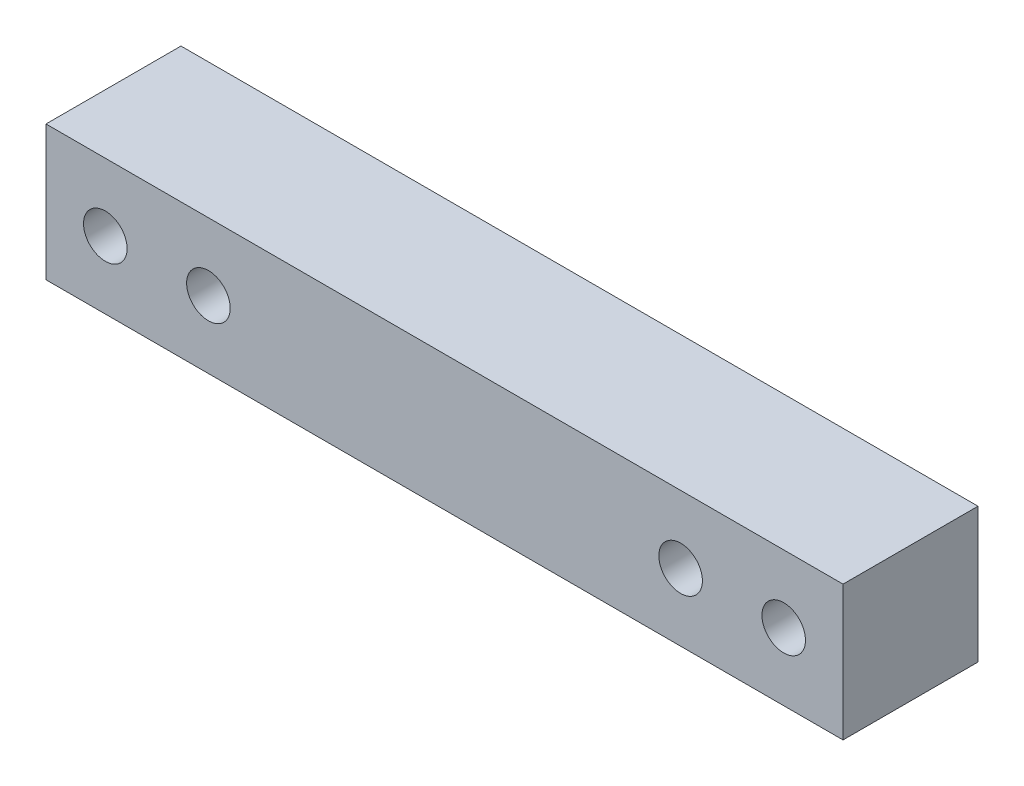
ISO-10303-21;
HEADER;
FILE_DESCRIPTION(('STEP AP214'),'2;1');
FILE_NAME('part.step','',(''),(''),'','','');
FILE_SCHEMA(('AUTOMOTIVE_DESIGN { 1 0 10303 214 1 1 1 1 }'));
ENDSEC;
DATA;
#1=APPLICATION_CONTEXT('core data for automotive mechanical design processes');
#2=APPLICATION_PROTOCOL_DEFINITION('international standard','automotive_design',2000,#1);
#3=PRODUCT_CONTEXT('',#1,'mechanical');
#4=PRODUCT('Part','Part','',(#3));
#5=PRODUCT_RELATED_PRODUCT_CATEGORY('part','',(#4));
#6=PRODUCT_DEFINITION_FORMATION('','',#4);
#7=PRODUCT_DEFINITION_CONTEXT('part definition',#1,'design');
#8=PRODUCT_DEFINITION('design','',#6,#7);
#9=PRODUCT_DEFINITION_SHAPE('','',#8);
#10=(LENGTH_UNIT() NAMED_UNIT(*) SI_UNIT(.MILLI.,.METRE.));
#11=(NAMED_UNIT(*) PLANE_ANGLE_UNIT() SI_UNIT($,.RADIAN.));
#12=(NAMED_UNIT(*) SI_UNIT($,.STERADIAN.) SOLID_ANGLE_UNIT());
#13=UNCERTAINTY_MEASURE_WITH_UNIT(LENGTH_MEASURE(1.E-05),#10,'distance_accuracy_value','');
#14=(GEOMETRIC_REPRESENTATION_CONTEXT(3) GLOBAL_UNCERTAINTY_ASSIGNED_CONTEXT((#13)) GLOBAL_UNIT_ASSIGNED_CONTEXT((#10,
#11,#12)) REPRESENTATION_CONTEXT('',''));
#15=CARTESIAN_POINT('',(0.,0.,0.));
#16=DIRECTION('',(0.,0.,1.));
#17=DIRECTION('',(1.,0.,0.));
#18=AXIS2_PLACEMENT_3D('',#15,#16,#17);
#19=CARTESIAN_POINT('',(-58.5761278195489,12.7,0.));
#20=DIRECTION('',(1.,0.,0.));
#21=DIRECTION('',(0.,0.,-1.));
#22=AXIS2_PLACEMENT_3D('',#19,#20,#21);
#23=PLANE('',#22);
#24=DIRECTION('',(0.,0.,1.));
#25=VECTOR('',#24,1.);
#26=CARTESIAN_POINT('',(-58.5761278195489,0.,0.));
#27=LINE('',#26,#25);
#28=CARTESIAN_POINT('',(-58.5761278195489,0.,-12.7));
#29=VERTEX_POINT('',#28);
#30=CARTESIAN_POINT('',(-58.5761278195489,0.,0.));
#31=VERTEX_POINT('',#30);
#32=EDGE_CURVE('E76',#29,#31,#27,.T.);
#33=ORIENTED_EDGE('',*,*,#32,.T.);
#34=DIRECTION('',(0.,-1.,0.));
#35=VECTOR('',#34,1.);
#36=CARTESIAN_POINT('',(-58.5761278195489,12.7,0.));
#37=LINE('',#36,#35);
#38=CARTESIAN_POINT('',(-58.5761278195489,12.7,0.));
#39=VERTEX_POINT('',#38);
#40=EDGE_CURVE('E11',#39,#31,#37,.T.);
#41=ORIENTED_EDGE('',*,*,#40,.F.);
#42=DIRECTION('',(0.,0.,1.));
#43=VECTOR('',#42,1.);
#44=CARTESIAN_POINT('',(-58.5761278195489,12.7,0.));
#45=LINE('',#44,#43);
#46=CARTESIAN_POINT('',(-58.5761278195489,12.7,-12.7));
#47=VERTEX_POINT('',#46);
#48=EDGE_CURVE('E66',#47,#39,#45,.T.);
#49=ORIENTED_EDGE('',*,*,#48,.F.);
#50=DIRECTION('',(0.,-1.,0.));
#51=VECTOR('',#50,1.);
#52=CARTESIAN_POINT('',(-58.5761278195489,0.,-12.7));
#53=LINE('',#52,#51);
#54=EDGE_CURVE('E86',#47,#29,#53,.T.);
#55=ORIENTED_EDGE('',*,*,#54,.T.);
#56=EDGE_LOOP('',(#33,#41,#49,#55));
#57=FACE_BOUND('',#56,.T.);
#58=ADVANCED_FACE('F33',(#57),#23,.F.);
#59=CARTESIAN_POINT('',(-58.5761278195489,12.7,0.));
#60=DIRECTION('',(0.,0.,-1.));
#61=DIRECTION('',(-1.,0.,0.));
#62=AXIS2_PLACEMENT_3D('',#59,#60,#61);
#63=PLANE('',#62);
#64=CARTESIAN_POINT('',(10.8415413533835,6.35,0.));
#65=DIRECTION('',(0.,0.,-1.));
#66=DIRECTION('',(-1.,0.,0.));
#67=AXIS2_PLACEMENT_3D('',#64,#65,#66);
#68=CIRCLE('',#67,2.05000000000001);
#69=CARTESIAN_POINT('',(8.79154135338345,6.35,0.));
#70=VERTEX_POINT('',#69);
#71=EDGE_CURVE('E141',#70,#70,#68,.F.);
#72=ORIENTED_EDGE('',*,*,#71,.F.);
#73=EDGE_LOOP('',(#72));
#74=FACE_BOUND('',#73,.T.);
#75=CARTESIAN_POINT('',(1.14154135338344,6.35,0.));
#76=DIRECTION('',(0.,0.,-1.));
#77=DIRECTION('',(-1.,0.,0.));
#78=AXIS2_PLACEMENT_3D('',#75,#76,#77);
#79=CIRCLE('',#78,2.05000000000001);
#80=CARTESIAN_POINT('',(-0.908458646616564,6.35,0.));
#81=VERTEX_POINT('',#80);
#82=EDGE_CURVE('E145',#81,#81,#79,.F.);
#83=ORIENTED_EDGE('',*,*,#82,.F.);
#84=EDGE_LOOP('',(#83));
#85=FACE_BOUND('',#84,.T.);
#86=CARTESIAN_POINT('',(-43.2937969924812,6.35,0.));
#87=DIRECTION('',(0.,0.,-1.));
#88=DIRECTION('',(-1.,0.,0.));
#89=AXIS2_PLACEMENT_3D('',#86,#87,#88);
#90=CIRCLE('',#89,2.05);
#91=CARTESIAN_POINT('',(-45.3437969924812,6.35,0.));
#92=VERTEX_POINT('',#91);
#93=EDGE_CURVE('E80',#92,#92,#90,.T.);
#94=ORIENTED_EDGE('',*,*,#93,.T.);
#95=EDGE_LOOP('',(#94));
#96=FACE_BOUND('',#95,.T.);
#97=CARTESIAN_POINT('',(-52.9937969924812,6.35,0.));
#98=DIRECTION('',(0.,0.,-1.));
#99=DIRECTION('',(-1.,0.,0.));
#100=AXIS2_PLACEMENT_3D('',#97,#98,#99);
#101=CIRCLE('',#100,2.05);
#102=CARTESIAN_POINT('',(-55.0437969924812,6.35,0.));
#103=VERTEX_POINT('',#102);
#104=EDGE_CURVE('E101',#103,#103,#101,.T.);
#105=ORIENTED_EDGE('',*,*,#104,.T.);
#106=EDGE_LOOP('',(#105));
#107=FACE_BOUND('',#106,.T.);
#108=DIRECTION('',(1.,0.,0.));
#109=VECTOR('',#108,1.);
#110=CARTESIAN_POINT('',(-58.5761278195489,0.,0.));
#111=LINE('',#110,#109);
#112=CARTESIAN_POINT('',(16.4238721804511,0.,0.));
#113=VERTEX_POINT('',#112);
#114=EDGE_CURVE('E60',#31,#113,#111,.T.);
#115=ORIENTED_EDGE('',*,*,#114,.T.);
#116=DIRECTION('',(0.,-1.,0.));
#117=VECTOR('',#116,1.);
#118=CARTESIAN_POINT('',(16.4238721804511,12.7,0.));
#119=LINE('',#118,#117);
#120=CARTESIAN_POINT('',(16.4238721804511,12.7,0.));
#121=VERTEX_POINT('',#120);
#122=EDGE_CURVE('E41',#121,#113,#119,.T.);
#123=ORIENTED_EDGE('',*,*,#122,.F.);
#124=DIRECTION('',(1.,0.,0.));
#125=VECTOR('',#124,1.);
#126=CARTESIAN_POINT('',(-58.5761278195489,12.7,0.));
#127=LINE('',#126,#125);
#128=EDGE_CURVE('E49',#39,#121,#127,.T.);
#129=ORIENTED_EDGE('',*,*,#128,.F.);
#130=ORIENTED_EDGE('',*,*,#40,.T.);
#131=EDGE_LOOP('',(#115,#123,#129,#130));
#132=FACE_BOUND('',#131,.T.);
#133=ADVANCED_FACE('F117',(#74,#85,#96,#107,#132),#63,.F.);
#134=CARTESIAN_POINT('',(16.4238721804511,12.7,0.));
#135=DIRECTION('',(-1.,0.,0.));
#136=DIRECTION('',(0.,0.,1.));
#137=AXIS2_PLACEMENT_3D('',#134,#135,#136);
#138=PLANE('',#137);
#139=DIRECTION('',(0.,0.,-1.));
#140=VECTOR('',#139,1.);
#141=CARTESIAN_POINT('',(16.4238721804511,0.,0.));
#142=LINE('',#141,#140);
#143=CARTESIAN_POINT('',(16.4238721804511,0.,-12.7));
#144=VERTEX_POINT('',#143);
#145=EDGE_CURVE('E107',#113,#144,#142,.T.);
#146=ORIENTED_EDGE('',*,*,#145,.T.);
#147=DIRECTION('',(0.,1.,0.));
#148=VECTOR('',#147,1.);
#149=CARTESIAN_POINT('',(16.4238721804511,12.7,-12.7));
#150=LINE('',#149,#148);
#151=CARTESIAN_POINT('',(16.4238721804511,12.7,-12.7));
#152=VERTEX_POINT('',#151);
#153=EDGE_CURVE('E89',#144,#152,#150,.T.);
#154=ORIENTED_EDGE('',*,*,#153,.T.);
#155=DIRECTION('',(0.,0.,-1.));
#156=VECTOR('',#155,1.);
#157=CARTESIAN_POINT('',(16.4238721804511,12.7,0.));
#158=LINE('',#157,#156);
#159=EDGE_CURVE('E109',#121,#152,#158,.T.);
#160=ORIENTED_EDGE('',*,*,#159,.F.);
#161=ORIENTED_EDGE('',*,*,#122,.T.);
#162=EDGE_LOOP('',(#146,#154,#160,#161));
#163=FACE_BOUND('',#162,.T.);
#164=ADVANCED_FACE('F115',(#163),#138,.F.);
#165=CARTESIAN_POINT('',(0.,12.7,0.));
#166=DIRECTION('',(0.,-1.,0.));
#167=DIRECTION('',(0.,0.,-1.));
#168=AXIS2_PLACEMENT_3D('',#165,#166,#167);
#169=PLANE('',#168);
#170=ORIENTED_EDGE('',*,*,#48,.T.);
#171=ORIENTED_EDGE('',*,*,#128,.T.);
#172=ORIENTED_EDGE('',*,*,#159,.T.);
#173=DIRECTION('',(-1.,0.,0.));
#174=VECTOR('',#173,1.);
#175=CARTESIAN_POINT('',(-58.5761278195489,12.7,-12.7));
#176=LINE('',#175,#174);
#177=EDGE_CURVE('E99',#152,#47,#176,.T.);
#178=ORIENTED_EDGE('',*,*,#177,.T.);
#179=EDGE_LOOP('',(#170,#171,#172,#178));
#180=FACE_BOUND('',#179,.T.);
#181=ADVANCED_FACE('F118',(#180),#169,.F.);
#182=CARTESIAN_POINT('',(0.,0.,0.));
#183=DIRECTION('',(0.,-1.,0.));
#184=DIRECTION('',(0.,0.,-1.));
#185=AXIS2_PLACEMENT_3D('',#182,#183,#184);
#186=PLANE('',#185);
#187=ORIENTED_EDGE('',*,*,#32,.F.);
#188=DIRECTION('',(1.,0.,0.));
#189=VECTOR('',#188,1.);
#190=CARTESIAN_POINT('',(16.4238721804511,0.,-12.7));
#191=LINE('',#190,#189);
#192=EDGE_CURVE('E79',#29,#144,#191,.T.);
#193=ORIENTED_EDGE('',*,*,#192,.T.);
#194=ORIENTED_EDGE('',*,*,#145,.F.);
#195=ORIENTED_EDGE('',*,*,#114,.F.);
#196=EDGE_LOOP('',(#187,#193,#194,#195));
#197=FACE_BOUND('',#196,.T.);
#198=ADVANCED_FACE('F78',(#197),#186,.T.);
#199=CARTESIAN_POINT('',(-52.9937969924812,6.35,2.7));
#200=DIRECTION('',(0.,0.,-1.));
#201=DIRECTION('',(-1.,0.,0.));
#202=AXIS2_PLACEMENT_3D('',#199,#200,#201);
#203=CYLINDRICAL_SURFACE('',#202,2.05);
#204=ORIENTED_EDGE('',*,*,#104,.F.);
#205=EDGE_LOOP('',(#204));
#206=FACE_BOUND('',#205,.T.);
#207=CARTESIAN_POINT('',(-52.9937969924812,6.35,-12.7));
#208=DIRECTION('',(0.,0.,1.));
#209=DIRECTION('',(1.,0.,0.));
#210=AXIS2_PLACEMENT_3D('',#207,#208,#209);
#211=CIRCLE('',#210,2.05000000000001);
#212=CARTESIAN_POINT('',(-50.9437969924812,6.35,-12.7));
#213=VERTEX_POINT('',#212);
#214=EDGE_CURVE('E91',#213,#213,#211,.T.);
#215=ORIENTED_EDGE('',*,*,#214,.F.);
#216=EDGE_LOOP('',(#215));
#217=FACE_BOUND('',#216,.T.);
#218=ADVANCED_FACE('F125',(#206,#217),#203,.F.);
#219=CARTESIAN_POINT('',(-43.2937969924812,6.35,2.7));
#220=DIRECTION('',(0.,0.,-1.));
#221=DIRECTION('',(-1.,0.,0.));
#222=AXIS2_PLACEMENT_3D('',#219,#220,#221);
#223=CYLINDRICAL_SURFACE('',#222,2.05);
#224=ORIENTED_EDGE('',*,*,#93,.F.);
#225=EDGE_LOOP('',(#224));
#226=FACE_BOUND('',#225,.T.);
#227=CARTESIAN_POINT('',(-43.2937969924812,6.35,-12.7));
#228=DIRECTION('',(0.,0.,1.));
#229=DIRECTION('',(1.,0.,0.));
#230=AXIS2_PLACEMENT_3D('',#227,#228,#229);
#231=CIRCLE('',#230,2.05000000000001);
#232=CARTESIAN_POINT('',(-41.2437969924812,6.35,-12.7));
#233=VERTEX_POINT('',#232);
#234=EDGE_CURVE('E94',#233,#233,#231,.T.);
#235=ORIENTED_EDGE('',*,*,#234,.F.);
#236=EDGE_LOOP('',(#235));
#237=FACE_BOUND('',#236,.T.);
#238=ADVANCED_FACE('F152',(#226,#237),#223,.F.);
#239=CARTESIAN_POINT('',(0.,0.,-12.7));
#240=DIRECTION('',(0.,0.,-1.));
#241=DIRECTION('',(-1.,0.,0.));
#242=AXIS2_PLACEMENT_3D('',#239,#240,#241);
#243=PLANE('',#242);
#244=CARTESIAN_POINT('',(10.8415413533835,6.35,-12.7));
#245=DIRECTION('',(0.,0.,-1.));
#246=DIRECTION('',(-1.,0.,0.));
#247=AXIS2_PLACEMENT_3D('',#244,#245,#246);
#248=CIRCLE('',#247,2.05000000000001);
#249=CARTESIAN_POINT('',(8.79154135338345,6.35,-12.7));
#250=VERTEX_POINT('',#249);
#251=EDGE_CURVE('E177',#250,#250,#248,.F.);
#252=ORIENTED_EDGE('',*,*,#251,.T.);
#253=EDGE_LOOP('',(#252));
#254=FACE_BOUND('',#253,.T.);
#255=CARTESIAN_POINT('',(1.14154135338344,6.35,-12.7));
#256=DIRECTION('',(0.,0.,-1.));
#257=DIRECTION('',(-1.,0.,0.));
#258=AXIS2_PLACEMENT_3D('',#255,#256,#257);
#259=CIRCLE('',#258,2.05000000000001);
#260=CARTESIAN_POINT('',(-0.908458646616564,6.35,-12.7));
#261=VERTEX_POINT('',#260);
#262=EDGE_CURVE('E182',#261,#261,#259,.F.);
#263=ORIENTED_EDGE('',*,*,#262,.T.);
#264=EDGE_LOOP('',(#263));
#265=FACE_BOUND('',#264,.T.);
#266=ORIENTED_EDGE('',*,*,#234,.T.);
#267=EDGE_LOOP('',(#266));
#268=FACE_BOUND('',#267,.T.);
#269=ORIENTED_EDGE('',*,*,#214,.T.);
#270=EDGE_LOOP('',(#269));
#271=FACE_BOUND('',#270,.T.);
#272=ORIENTED_EDGE('',*,*,#54,.F.);
#273=ORIENTED_EDGE('',*,*,#177,.F.);
#274=ORIENTED_EDGE('',*,*,#153,.F.);
#275=ORIENTED_EDGE('',*,*,#192,.F.);
#276=EDGE_LOOP('',(#272,#273,#274,#275));
#277=FACE_BOUND('',#276,.T.);
#278=ADVANCED_FACE('F84',(#254,#265,#268,#271,#277),#243,.T.);
#279=CARTESIAN_POINT('',(1.14154135338344,6.35,9.00000000000001));
#280=DIRECTION('',(0.,0.,-1.));
#281=DIRECTION('',(-1.,0.,0.));
#282=AXIS2_PLACEMENT_3D('',#279,#280,#281);
#283=CYLINDRICAL_SURFACE('',#282,2.05000000000001);
#284=ORIENTED_EDGE('',*,*,#262,.F.);
#285=EDGE_LOOP('',(#284));
#286=FACE_BOUND('',#285,.T.);
#287=ORIENTED_EDGE('',*,*,#82,.T.);
#288=EDGE_LOOP('',(#287));
#289=FACE_BOUND('',#288,.T.);
#290=ADVANCED_FACE('F155',(#286,#289),#283,.F.);
#291=CARTESIAN_POINT('',(10.8415413533835,6.35,9.00000000000001));
#292=DIRECTION('',(0.,0.,-1.));
#293=DIRECTION('',(-1.,0.,0.));
#294=AXIS2_PLACEMENT_3D('',#291,#292,#293);
#295=CYLINDRICAL_SURFACE('',#294,2.05000000000001);
#296=ORIENTED_EDGE('',*,*,#251,.F.);
#297=EDGE_LOOP('',(#296));
#298=FACE_BOUND('',#297,.T.);
#299=ORIENTED_EDGE('',*,*,#71,.T.);
#300=EDGE_LOOP('',(#299));
#301=FACE_BOUND('',#300,.T.);
#302=ADVANCED_FACE('F162',(#298,#301),#295,.F.);
#303=CLOSED_SHELL('',(#58,#133,#164,#181,#198,#218,#238,#278,#290,#302));
#304=MANIFOLD_SOLID_BREP('B2',#303);
#305=ADVANCED_BREP_SHAPE_REPRESENTATION('',(#18,#304),#14);
#306=SHAPE_DEFINITION_REPRESENTATION(#9,#305);
ENDSEC;
END-ISO-10303-21;
